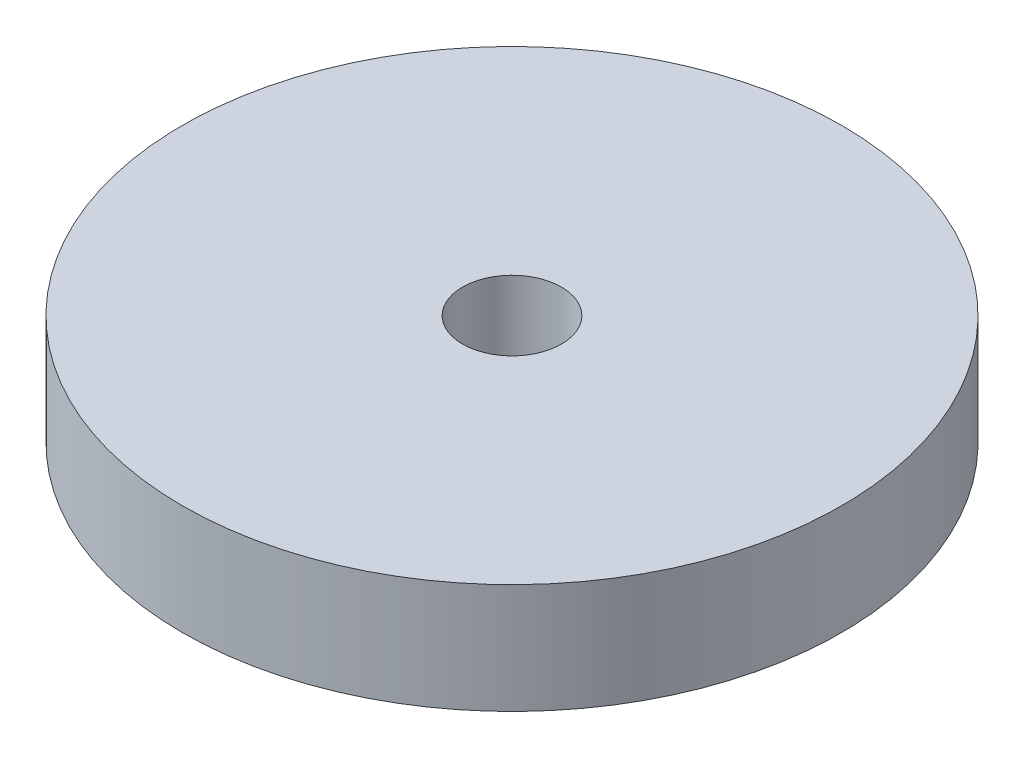
ISO-10303-21;
HEADER;
FILE_DESCRIPTION(('STEP AP214'),'2;1');
FILE_NAME('part.step','',(''),(''),'','','');
FILE_SCHEMA(('AUTOMOTIVE_DESIGN { 1 0 10303 214 1 1 1 1 }'));
ENDSEC;
DATA;
#1=APPLICATION_CONTEXT('core data for automotive mechanical design processes');
#2=APPLICATION_PROTOCOL_DEFINITION('international standard','automotive_design',2000,#1);
#3=PRODUCT_CONTEXT('',#1,'mechanical');
#4=PRODUCT('Part','Part','',(#3));
#5=PRODUCT_RELATED_PRODUCT_CATEGORY('part','',(#4));
#6=PRODUCT_DEFINITION_FORMATION('','',#4);
#7=PRODUCT_DEFINITION_CONTEXT('part definition',#1,'design');
#8=PRODUCT_DEFINITION('design','',#6,#7);
#9=PRODUCT_DEFINITION_SHAPE('','',#8);
#10=(LENGTH_UNIT() NAMED_UNIT(*) SI_UNIT(.MILLI.,.METRE.));
#11=(NAMED_UNIT(*) PLANE_ANGLE_UNIT() SI_UNIT($,.RADIAN.));
#12=(NAMED_UNIT(*) SI_UNIT($,.STERADIAN.) SOLID_ANGLE_UNIT());
#13=UNCERTAINTY_MEASURE_WITH_UNIT(LENGTH_MEASURE(1.E-05),#10,'distance_accuracy_value','');
#14=(GEOMETRIC_REPRESENTATION_CONTEXT(3) GLOBAL_UNCERTAINTY_ASSIGNED_CONTEXT((#13)) GLOBAL_UNIT_ASSIGNED_CONTEXT((#10,
#11,#12)) REPRESENTATION_CONTEXT('',''));
#15=CARTESIAN_POINT('',(0.,0.,0.));
#16=DIRECTION('',(0.,0.,1.));
#17=DIRECTION('',(1.,0.,0.));
#18=AXIS2_PLACEMENT_3D('',#15,#16,#17);
#19=CARTESIAN_POINT('',(27.6329664712876,2.,12.8931479649299));
#20=DIRECTION('',(0.,-1.,0.));
#21=DIRECTION('',(0.,0.,-1.));
#22=AXIS2_PLACEMENT_3D('',#19,#20,#21);
#23=CYLINDRICAL_SURFACE('',#22,6.);
#24=CARTESIAN_POINT('',(27.6329664712876,2.,12.8931479649299));
#25=DIRECTION('',(0.,1.,0.));
#26=DIRECTION('',(0.,0.,1.));
#27=AXIS2_PLACEMENT_3D('',#24,#25,#26);
#28=CIRCLE('',#27,6.);
#29=CARTESIAN_POINT('',(27.6329664712876,2.,18.8931479649299));
#30=VERTEX_POINT('',#29);
#31=EDGE_CURVE('E10',#30,#30,#28,.T.);
#32=ORIENTED_EDGE('',*,*,#31,.F.);
#33=EDGE_LOOP('',(#32));
#34=FACE_BOUND('',#33,.T.);
#35=CARTESIAN_POINT('',(27.6329664712876,0.,12.8931479649299));
#36=DIRECTION('',(0.,1.,0.));
#37=DIRECTION('',(0.,0.,1.));
#38=AXIS2_PLACEMENT_3D('',#35,#36,#37);
#39=CIRCLE('',#38,6.);
#40=CARTESIAN_POINT('',(27.6329664712876,0.,18.8931479649299));
#41=VERTEX_POINT('',#40);
#42=EDGE_CURVE('E34',#41,#41,#39,.T.);
#43=ORIENTED_EDGE('',*,*,#42,.T.);
#44=EDGE_LOOP('',(#43));
#45=FACE_BOUND('',#44,.T.);
#46=ADVANCED_FACE('F31',(#34,#45),#23,.T.);
#47=CARTESIAN_POINT('',(27.6329664712876,2.,12.8931479649299));
#48=DIRECTION('',(0.,1.,0.));
#49=DIRECTION('',(0.,0.,1.));
#50=AXIS2_PLACEMENT_3D('',#47,#48,#49);
#51=PLANE('',#50);
#52=CARTESIAN_POINT('',(27.6329664712876,2.,12.8931479649299));
#53=DIRECTION('',(0.,1.,0.));
#54=DIRECTION('',(0.,0.,1.));
#55=AXIS2_PLACEMENT_3D('',#52,#53,#54);
#56=CIRCLE('',#55,0.9);
#57=CARTESIAN_POINT('',(27.6329664712876,2.,13.7931479649299));
#58=VERTEX_POINT('',#57);
#59=EDGE_CURVE('E43',#58,#58,#56,.T.);
#60=ORIENTED_EDGE('',*,*,#59,.F.);
#61=EDGE_LOOP('',(#60));
#62=FACE_BOUND('',#61,.T.);
#63=ORIENTED_EDGE('',*,*,#31,.T.);
#64=EDGE_LOOP('',(#63));
#65=FACE_BOUND('',#64,.T.);
#66=ADVANCED_FACE('F58',(#62,#65),#51,.T.);
#67=CARTESIAN_POINT('',(27.6329664712876,0.,12.8931479649299));
#68=DIRECTION('',(0.,1.,0.));
#69=DIRECTION('',(0.,0.,1.));
#70=AXIS2_PLACEMENT_3D('',#67,#68,#69);
#71=PLANE('',#70);
#72=CARTESIAN_POINT('',(27.6329664712876,0.,12.8931479649299));
#73=DIRECTION('',(0.,1.,0.));
#74=DIRECTION('',(0.,0.,1.));
#75=AXIS2_PLACEMENT_3D('',#72,#73,#74);
#76=CIRCLE('',#75,0.9);
#77=CARTESIAN_POINT('',(27.6329664712876,0.,13.7931479649299));
#78=VERTEX_POINT('',#77);
#79=EDGE_CURVE('E41',#78,#78,#76,.T.);
#80=ORIENTED_EDGE('',*,*,#79,.T.);
#81=EDGE_LOOP('',(#80));
#82=FACE_BOUND('',#81,.T.);
#83=ORIENTED_EDGE('',*,*,#42,.F.);
#84=EDGE_LOOP('',(#83));
#85=FACE_BOUND('',#84,.T.);
#86=ADVANCED_FACE('F49',(#82,#85),#71,.F.);
#87=CARTESIAN_POINT('',(27.6329664712876,0.,12.8931479649299));
#88=DIRECTION('',(0.,1.,0.));
#89=DIRECTION('',(0.,0.,1.));
#90=AXIS2_PLACEMENT_3D('',#87,#88,#89);
#91=CYLINDRICAL_SURFACE('',#90,0.9);
#92=ORIENTED_EDGE('',*,*,#79,.F.);
#93=EDGE_LOOP('',(#92));
#94=FACE_BOUND('',#93,.T.);
#95=ORIENTED_EDGE('',*,*,#59,.T.);
#96=EDGE_LOOP('',(#95));
#97=FACE_BOUND('',#96,.T.);
#98=ADVANCED_FACE('F52',(#94,#97),#91,.F.);
#99=CLOSED_SHELL('',(#46,#66,#86,#98));
#100=MANIFOLD_SOLID_BREP('B2',#99);
#101=ADVANCED_BREP_SHAPE_REPRESENTATION('',(#18,#100),#14);
#102=SHAPE_DEFINITION_REPRESENTATION(#9,#101);
ENDSEC;
END-ISO-10303-21;
